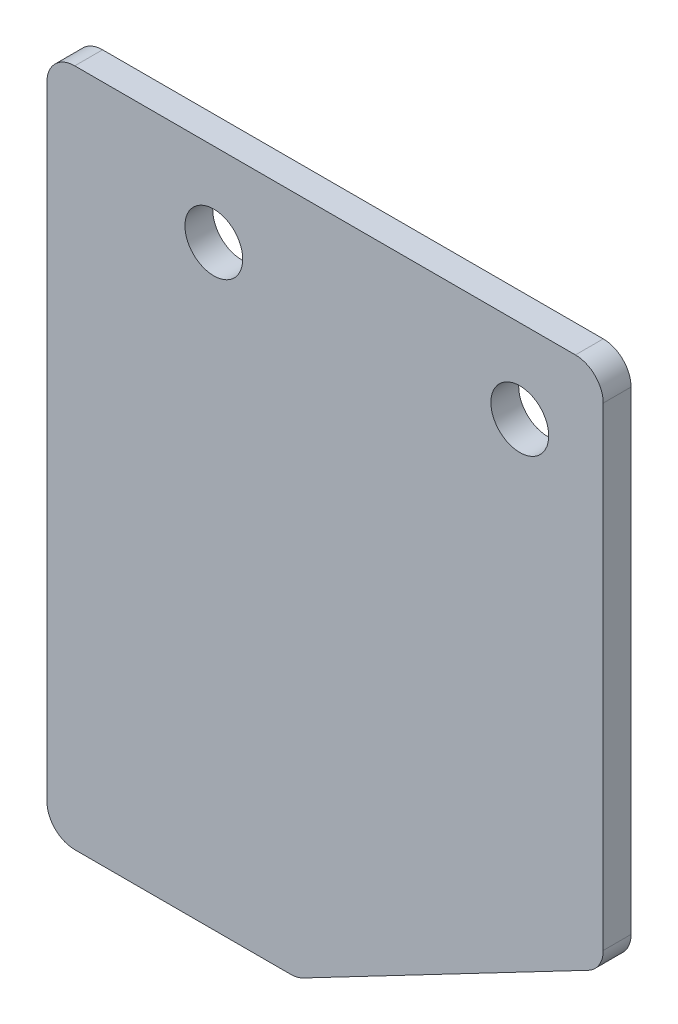
ISO-10303-21;
HEADER;
FILE_DESCRIPTION(('STEP AP214'),'2;1');
FILE_NAME('part.step','',(''),(''),'','','');
FILE_SCHEMA(('AUTOMOTIVE_DESIGN { 1 0 10303 214 1 1 1 1 }'));
ENDSEC;
DATA;
#1=APPLICATION_CONTEXT('core data for automotive mechanical design processes');
#2=APPLICATION_PROTOCOL_DEFINITION('international standard','automotive_design',2000,#1);
#3=PRODUCT_CONTEXT('',#1,'mechanical');
#4=PRODUCT('Part','Part','',(#3));
#5=PRODUCT_RELATED_PRODUCT_CATEGORY('part','',(#4));
#6=PRODUCT_DEFINITION_FORMATION('','',#4);
#7=PRODUCT_DEFINITION_CONTEXT('part definition',#1,'design');
#8=PRODUCT_DEFINITION('design','',#6,#7);
#9=PRODUCT_DEFINITION_SHAPE('','',#8);
#10=(LENGTH_UNIT() NAMED_UNIT(*) SI_UNIT(.MILLI.,.METRE.));
#11=(NAMED_UNIT(*) PLANE_ANGLE_UNIT() SI_UNIT($,.RADIAN.));
#12=(NAMED_UNIT(*) SI_UNIT($,.STERADIAN.) SOLID_ANGLE_UNIT());
#13=UNCERTAINTY_MEASURE_WITH_UNIT(LENGTH_MEASURE(1.E-05),#10,'distance_accuracy_value','');
#14=(GEOMETRIC_REPRESENTATION_CONTEXT(3) GLOBAL_UNCERTAINTY_ASSIGNED_CONTEXT((#13)) GLOBAL_UNIT_ASSIGNED_CONTEXT((#10,
#11,#12)) REPRESENTATION_CONTEXT('',''));
#15=CARTESIAN_POINT('',(0.,0.,0.));
#16=DIRECTION('',(0.,0.,1.));
#17=DIRECTION('',(1.,0.,0.));
#18=AXIS2_PLACEMENT_3D('',#15,#16,#17);
#19=CARTESIAN_POINT('',(63.5,-20.3365254026944,-1.69135538907739E-13));
#20=DIRECTION('',(-1.,0.,0.));
#21=DIRECTION('',(0.,-0.707106781186544,-0.707106781186551));
#22=AXIS2_PLACEMENT_3D('',#19,#20,#21);
#23=PLANE('',#22);
#24=DIRECTION('',(0.,1.,0.));
#25=VECTOR('',#24,1.);
#26=CARTESIAN_POINT('',(63.5,-20.3365254026944,3.17499999999984));
#27=LINE('',#26,#25);
#28=CARTESIAN_POINT('',(63.5,53.975,3.175));
#29=VERTEX_POINT('',#28);
#30=CARTESIAN_POINT('',(63.5,-0.135098473034324,3.17499999999997));
#31=VERTEX_POINT('',#30);
#32=EDGE_CURVE('E224',#29,#31,#27,.F.);
#33=ORIENTED_EDGE('',*,*,#32,.T.);
#34=DIRECTION('',(0.,0.,-1.));
#35=VECTOR('',#34,1.);
#36=CARTESIAN_POINT('',(63.5,-0.135098473034306,0.));
#37=LINE('',#36,#35);
#38=CARTESIAN_POINT('',(63.5,-0.135098473034306,0.));
#39=VERTEX_POINT('',#38);
#40=EDGE_CURVE('E14',#31,#39,#37,.T.);
#41=ORIENTED_EDGE('',*,*,#40,.T.);
#42=DIRECTION('',(0.,-1.,0.));
#43=VECTOR('',#42,1.);
#44=CARTESIAN_POINT('',(63.5,18.6934105670383,1.02782365951626E-13));
#45=LINE('',#44,#43);
#46=CARTESIAN_POINT('',(63.5,53.975,0.));
#47=VERTEX_POINT('',#46);
#48=EDGE_CURVE('E229',#47,#39,#45,.T.);
#49=ORIENTED_EDGE('',*,*,#48,.F.);
#50=DIRECTION('',(0.,0.,-1.));
#51=VECTOR('',#50,1.);
#52=CARTESIAN_POINT('',(63.5,53.975,3.175));
#53=LINE('',#52,#51);
#54=EDGE_CURVE('E171',#47,#29,#53,.F.);
#55=ORIENTED_EDGE('',*,*,#54,.T.);
#56=EDGE_LOOP('',(#33,#41,#49,#55));
#57=FACE_BOUND('',#56,.T.);
#58=ADVANCED_FACE('F63',(#57),#23,.F.);
#59=CARTESIAN_POINT('',(0.,16.4483465367711,1.13624387676481E-13));
#60=DIRECTION('',(1.,0.,0.));
#61=DIRECTION('',(0.,0.707106781186544,0.707106781186551));
#62=AXIS2_PLACEMENT_3D('',#59,#60,#61);
#63=PLANE('',#62);
#64=DIRECTION('',(0.,1.,0.));
#65=VECTOR('',#64,1.);
#66=CARTESIAN_POINT('',(0.,18.6934105670383,1.30971622436249E-13));
#67=LINE('',#66,#65);
#68=CARTESIAN_POINT('',(0.,-17.1615254026944,-1.20563281580388E-13));
#69=VERTEX_POINT('',#68);
#70=CARTESIAN_POINT('',(0.,53.975,0.));
#71=VERTEX_POINT('',#70);
#72=EDGE_CURVE('E140',#69,#71,#67,.T.);
#73=ORIENTED_EDGE('',*,*,#72,.F.);
#74=DIRECTION('',(0.,0.,1.));
#75=VECTOR('',#74,1.);
#76=CARTESIAN_POINT('',(0.,-17.1615254026944,-1.20563281580388E-13));
#77=LINE('',#76,#75);
#78=CARTESIAN_POINT('',(0.,-17.1615254026944,3.17499999999988));
#79=VERTEX_POINT('',#78);
#80=EDGE_CURVE('E154',#69,#79,#77,.T.);
#81=ORIENTED_EDGE('',*,*,#80,.T.);
#82=DIRECTION('',(0.,-1.,0.));
#83=VECTOR('',#82,1.);
#84=CARTESIAN_POINT('',(0.,16.448346536771,3.17500000000012));
#85=LINE('',#84,#83);
#86=CARTESIAN_POINT('',(0.,53.975,3.175));
#87=VERTEX_POINT('',#86);
#88=EDGE_CURVE('E161',#79,#87,#85,.F.);
#89=ORIENTED_EDGE('',*,*,#88,.T.);
#90=DIRECTION('',(0.,0.,-1.));
#91=VECTOR('',#90,1.);
#92=CARTESIAN_POINT('',(0.,53.975,3.175));
#93=LINE('',#92,#91);
#94=EDGE_CURVE('E158',#87,#71,#93,.T.);
#95=ORIENTED_EDGE('',*,*,#94,.T.);
#96=EDGE_LOOP('',(#73,#81,#89,#95));
#97=FACE_BOUND('',#96,.T.);
#98=ADVANCED_FACE('F159',(#97),#63,.F.);
#99=CARTESIAN_POINT('',(0.,18.6934105670383,1.30971622436249E-13));
#100=DIRECTION('',(0.,0.,1.));
#101=DIRECTION('',(0.,-1.,0.));
#102=AXIS2_PLACEMENT_3D('',#99,#100,#101);
#103=PLANE('',#102);
#104=DIRECTION('',(-1.,0.,0.));
#105=VECTOR('',#104,1.);
#106=CARTESIAN_POINT('',(0.,-20.3365254026944,-1.37910516340156E-13));
#107=LINE('',#106,#105);
#108=CARTESIAN_POINT('',(27.7943403610849,-20.3365254026944,-1.51788304147971E-13));
#109=VERTEX_POINT('',#108);
#110=CARTESIAN_POINT('',(3.17499999999999,-20.3365254026944,-1.37910516340156E-13));
#111=VERTEX_POINT('',#110);
#112=EDGE_CURVE('E155',#109,#111,#107,.T.);
#113=ORIENTED_EDGE('',*,*,#112,.T.);
#114=CARTESIAN_POINT('',(3.17499999999999,-17.1615254026944,-1.17093834628434E-13));
#115=DIRECTION('',(0.,0.,1.));
#116=DIRECTION('',(0.,-1.,0.));
#117=AXIS2_PLACEMENT_3D('',#114,#115,#116);
#118=CIRCLE('',#117,3.175);
#119=EDGE_CURVE('E150',#111,#69,#118,.F.);
#120=ORIENTED_EDGE('',*,*,#119,.T.);
#121=ORIENTED_EDGE('',*,*,#72,.T.);
#122=CARTESIAN_POINT('',(3.175,53.975,0.));
#123=DIRECTION('',(0.,0.,-1.));
#124=DIRECTION('',(-1.,0.,0.));
#125=AXIS2_PLACEMENT_3D('',#122,#123,#124);
#126=CIRCLE('',#125,3.175);
#127=CARTESIAN_POINT('',(3.175,57.15,0.));
#128=VERTEX_POINT('',#127);
#129=EDGE_CURVE('E147',#71,#128,#126,.T.);
#130=ORIENTED_EDGE('',*,*,#129,.T.);
#131=DIRECTION('',(-1.,0.,0.));
#132=VECTOR('',#131,1.);
#133=CARTESIAN_POINT('',(0.,57.15,0.));
#134=LINE('',#133,#132);
#135=CARTESIAN_POINT('',(60.325,57.15,0.));
#136=VERTEX_POINT('',#135);
#137=EDGE_CURVE('E255',#136,#128,#134,.T.);
#138=ORIENTED_EDGE('',*,*,#137,.F.);
#139=CARTESIAN_POINT('',(60.325,53.975,0.));
#140=DIRECTION('',(0.,0.,-1.));
#141=DIRECTION('',(-1.,0.,0.));
#142=AXIS2_PLACEMENT_3D('',#139,#140,#141);
#143=CIRCLE('',#142,3.175);
#144=EDGE_CURVE('E165',#136,#47,#143,.T.);
#145=ORIENTED_EDGE('',*,*,#144,.T.);
#146=ORIENTED_EDGE('',*,*,#48,.T.);
#147=CARTESIAN_POINT('',(60.325,-0.135098473034306,0.));
#148=DIRECTION('',(0.,0.,1.));
#149=DIRECTION('',(0.,-1.,0.));
#150=AXIS2_PLACEMENT_3D('',#147,#148,#149);
#151=CIRCLE('',#150,3.175);
#152=CARTESIAN_POINT('',(61.7973100042708,-2.94809123010356,0.));
#153=VERTEX_POINT('',#152);
#154=EDGE_CURVE('E78',#39,#153,#151,.F.);
#155=ORIENTED_EDGE('',*,*,#154,.T.);
#156=DIRECTION('',(0.885981970730476,0.463719686384503,0.));
#157=VECTOR('',#156,1.);
#158=CARTESIAN_POINT('',(63.5,-2.05690958429808,0.));
#159=LINE('',#158,#157);
#160=CARTESIAN_POINT('',(29.2666503653557,-19.9745181597637,-1.44849410244063E-13));
#161=VERTEX_POINT('',#160);
#162=EDGE_CURVE('E164',#161,#153,#159,.T.);
#163=ORIENTED_EDGE('',*,*,#162,.F.);
#164=CARTESIAN_POINT('',(27.7943403610849,-17.1615254026944,-1.37910516340156E-13));
#165=DIRECTION('',(0.,0.,1.));
#166=DIRECTION('',(0.,-1.,0.));
#167=AXIS2_PLACEMENT_3D('',#164,#165,#166);
#168=CIRCLE('',#167,3.175);
#169=EDGE_CURVE('E86',#161,#109,#168,.F.);
#170=ORIENTED_EDGE('',*,*,#169,.T.);
#171=EDGE_LOOP('',(#113,#120,#121,#130,#138,#145,#146,#155,#163,#170));
#172=FACE_BOUND('',#171,.T.);
#173=CARTESIAN_POINT('',(53.975,47.625,0.));
#174=DIRECTION('',(0.,0.,-1.));
#175=DIRECTION('',(-1.,0.,0.));
#176=AXIS2_PLACEMENT_3D('',#173,#174,#175);
#177=CIRCLE('',#176,3.29999999999999);
#178=CARTESIAN_POINT('',(50.675,47.625,0.));
#179=VERTEX_POINT('',#178);
#180=EDGE_CURVE('E265',#179,#179,#177,.T.);
#181=ORIENTED_EDGE('',*,*,#180,.F.);
#182=EDGE_LOOP('',(#181));
#183=FACE_BOUND('',#182,.T.);
#184=CARTESIAN_POINT('',(19.05,47.625,0.));
#185=DIRECTION('',(0.,0.,-1.));
#186=DIRECTION('',(-1.,0.,0.));
#187=AXIS2_PLACEMENT_3D('',#184,#185,#186);
#188=CIRCLE('',#187,3.29999999999999);
#189=CARTESIAN_POINT('',(15.75,47.625,0.));
#190=VERTEX_POINT('',#189);
#191=EDGE_CURVE('E258',#190,#190,#188,.T.);
#192=ORIENTED_EDGE('',*,*,#191,.F.);
#193=EDGE_LOOP('',(#192));
#194=FACE_BOUND('',#193,.T.);
#195=ADVANCED_FACE('F143',(#172,#183,#194),#103,.F.);
#196=CARTESIAN_POINT('',(0.,0.,3.175));
#197=DIRECTION('',(0.,0.,-1.));
#198=DIRECTION('',(-1.,0.,0.));
#199=AXIS2_PLACEMENT_3D('',#196,#197,#198);
#200=PLANE('',#199);
#201=ORIENTED_EDGE('',*,*,#88,.F.);
#202=CARTESIAN_POINT('',(3.17499999999999,-17.1615254026944,3.17499999999988));
#203=DIRECTION('',(0.,0.,1.));
#204=DIRECTION('',(0.,-1.,0.));
#205=AXIS2_PLACEMENT_3D('',#202,#203,#204);
#206=CIRCLE('',#205,3.175);
#207=CARTESIAN_POINT('',(3.17499999999999,-20.3365254026944,3.17499999999986));
#208=VERTEX_POINT('',#207);
#209=EDGE_CURVE('E203',#79,#208,#206,.T.);
#210=ORIENTED_EDGE('',*,*,#209,.T.);
#211=DIRECTION('',(1.,0.,0.));
#212=VECTOR('',#211,1.);
#213=CARTESIAN_POINT('',(0.,-20.3365254026944,3.17499999999986));
#214=LINE('',#213,#212);
#215=CARTESIAN_POINT('',(27.7943403610849,-20.3365254026944,3.17499999999985));
#216=VERTEX_POINT('',#215);
#217=EDGE_CURVE('E232',#216,#208,#214,.F.);
#218=ORIENTED_EDGE('',*,*,#217,.F.);
#219=CARTESIAN_POINT('',(27.7943403610849,-17.1615254026944,3.17499999999987));
#220=DIRECTION('',(0.,0.,1.));
#221=DIRECTION('',(0.,-1.,0.));
#222=AXIS2_PLACEMENT_3D('',#219,#220,#221);
#223=CIRCLE('',#222,3.175);
#224=CARTESIAN_POINT('',(29.2666503653557,-19.9745181597637,3.17499999999986));
#225=VERTEX_POINT('',#224);
#226=EDGE_CURVE('E199',#216,#225,#223,.T.);
#227=ORIENTED_EDGE('',*,*,#226,.T.);
#228=DIRECTION('',(0.885981970730476,0.463719686384503,0.));
#229=VECTOR('',#228,1.);
#230=CARTESIAN_POINT('',(63.5,-2.0569095842981,3.17499999999996));
#231=LINE('',#230,#229);
#232=CARTESIAN_POINT('',(61.7973100042708,-2.94809123010359,3.17499999999996));
#233=VERTEX_POINT('',#232);
#234=EDGE_CURVE('E220',#225,#233,#231,.T.);
#235=ORIENTED_EDGE('',*,*,#234,.T.);
#236=CARTESIAN_POINT('',(60.325,-0.135098473034327,3.17499999999997));
#237=DIRECTION('',(0.,0.,1.));
#238=DIRECTION('',(0.,-1.,0.));
#239=AXIS2_PLACEMENT_3D('',#236,#237,#238);
#240=CIRCLE('',#239,3.175);
#241=EDGE_CURVE('E195',#233,#31,#240,.T.);
#242=ORIENTED_EDGE('',*,*,#241,.T.);
#243=ORIENTED_EDGE('',*,*,#32,.F.);
#244=CARTESIAN_POINT('',(60.325,53.975,3.175));
#245=DIRECTION('',(0.,0.,-1.));
#246=DIRECTION('',(-1.,0.,0.));
#247=AXIS2_PLACEMENT_3D('',#244,#245,#246);
#248=CIRCLE('',#247,3.175);
#249=CARTESIAN_POINT('',(60.325,57.15,3.175));
#250=VERTEX_POINT('',#249);
#251=EDGE_CURVE('E176',#29,#250,#248,.F.);
#252=ORIENTED_EDGE('',*,*,#251,.T.);
#253=DIRECTION('',(-1.,0.,0.));
#254=VECTOR('',#253,1.);
#255=CARTESIAN_POINT('',(0.,57.15,3.175));
#256=LINE('',#255,#254);
#257=CARTESIAN_POINT('',(3.175,57.15,3.175));
#258=VERTEX_POINT('',#257);
#259=EDGE_CURVE('E182',#250,#258,#256,.T.);
#260=ORIENTED_EDGE('',*,*,#259,.T.);
#261=CARTESIAN_POINT('',(3.175,53.975,3.175));
#262=DIRECTION('',(0.,0.,-1.));
#263=DIRECTION('',(-1.,0.,0.));
#264=AXIS2_PLACEMENT_3D('',#261,#262,#263);
#265=CIRCLE('',#264,3.175);
#266=EDGE_CURVE('E180',#258,#87,#265,.F.);
#267=ORIENTED_EDGE('',*,*,#266,.T.);
#268=EDGE_LOOP('',(#201,#210,#218,#227,#235,#242,#243,#252,#260,#267));
#269=FACE_BOUND('',#268,.T.);
#270=CARTESIAN_POINT('',(53.975,47.625,3.175));
#271=DIRECTION('',(0.,0.,1.));
#272=DIRECTION('',(1.,0.,0.));
#273=AXIS2_PLACEMENT_3D('',#270,#271,#272);
#274=CIRCLE('',#273,3.29999999999999);
#275=CARTESIAN_POINT('',(57.275,47.625,3.175));
#276=VERTEX_POINT('',#275);
#277=EDGE_CURVE('E186',#276,#276,#274,.T.);
#278=ORIENTED_EDGE('',*,*,#277,.F.);
#279=EDGE_LOOP('',(#278));
#280=FACE_BOUND('',#279,.T.);
#281=CARTESIAN_POINT('',(19.05,47.625,3.175));
#282=DIRECTION('',(0.,0.,1.));
#283=DIRECTION('',(1.,0.,0.));
#284=AXIS2_PLACEMENT_3D('',#281,#282,#283);
#285=CIRCLE('',#284,3.29999999999999);
#286=CARTESIAN_POINT('',(22.35,47.625,3.175));
#287=VERTEX_POINT('',#286);
#288=EDGE_CURVE('E262',#287,#287,#285,.T.);
#289=ORIENTED_EDGE('',*,*,#288,.F.);
#290=EDGE_LOOP('',(#289));
#291=FACE_BOUND('',#290,.T.);
#292=ADVANCED_FACE('F65',(#269,#280,#291),#200,.F.);
#293=CARTESIAN_POINT('',(0.,-20.3365254026944,-1.4137996329211E-13));
#294=DIRECTION('',(0.,1.,0.));
#295=DIRECTION('',(0.,0.,1.));
#296=AXIS2_PLACEMENT_3D('',#293,#294,#295);
#297=PLANE('',#296);
#298=ORIENTED_EDGE('',*,*,#217,.T.);
#299=DIRECTION('',(0.,0.,1.));
#300=VECTOR('',#299,1.);
#301=CARTESIAN_POINT('',(3.17499999999999,-20.3365254026944,-1.4137996329211E-13));
#302=LINE('',#301,#300);
#303=EDGE_CURVE('E209',#208,#111,#302,.F.);
#304=ORIENTED_EDGE('',*,*,#303,.T.);
#305=ORIENTED_EDGE('',*,*,#112,.F.);
#306=DIRECTION('',(0.,0.,-1.));
#307=VECTOR('',#306,1.);
#308=CARTESIAN_POINT('',(27.7943403610849,-20.3365254026944,-1.4137996329211E-13));
#309=LINE('',#308,#307);
#310=EDGE_CURVE('E207',#109,#216,#309,.F.);
#311=ORIENTED_EDGE('',*,*,#310,.T.);
#312=EDGE_LOOP('',(#298,#304,#305,#311));
#313=FACE_BOUND('',#312,.T.);
#314=ADVANCED_FACE('F247',(#313),#297,.F.);
#315=CARTESIAN_POINT('',(63.5,-2.0569095842981,3.17499999999996));
#316=DIRECTION('',(-0.463719686384503,0.885981970730476,0.));
#317=DIRECTION('',(0.,0.,1.));
#318=AXIS2_PLACEMENT_3D('',#315,#316,#317);
#319=PLANE('',#318);
#320=ORIENTED_EDGE('',*,*,#234,.F.);
#321=DIRECTION('',(0.,0.,-1.));
#322=VECTOR('',#321,1.);
#323=CARTESIAN_POINT('',(29.2666503653557,-19.9745181597637,3.17499999999984));
#324=LINE('',#323,#322);
#325=EDGE_CURVE('E71',#225,#161,#324,.T.);
#326=ORIENTED_EDGE('',*,*,#325,.T.);
#327=ORIENTED_EDGE('',*,*,#162,.T.);
#328=DIRECTION('',(0.,0.,-1.));
#329=VECTOR('',#328,1.);
#330=CARTESIAN_POINT('',(61.7973100042708,-2.94809123010359,3.17499999999996));
#331=LINE('',#330,#329);
#332=EDGE_CURVE('E214',#153,#233,#331,.F.);
#333=ORIENTED_EDGE('',*,*,#332,.T.);
#334=EDGE_LOOP('',(#320,#326,#327,#333));
#335=FACE_BOUND('',#334,.T.);
#336=ADVANCED_FACE('F217',(#335),#319,.F.);
#337=CARTESIAN_POINT('',(3.17499999999999,-17.1615254026944,-1.20563281580388E-13));
#338=DIRECTION('',(0.,0.,1.));
#339=DIRECTION('',(0.,-1.,0.));
#340=AXIS2_PLACEMENT_3D('',#337,#338,#339);
#341=CYLINDRICAL_SURFACE('',#340,3.175);
#342=ORIENTED_EDGE('',*,*,#119,.F.);
#343=ORIENTED_EDGE('',*,*,#303,.F.);
#344=ORIENTED_EDGE('',*,*,#209,.F.);
#345=ORIENTED_EDGE('',*,*,#80,.F.);
#346=EDGE_LOOP('',(#342,#343,#344,#345));
#347=FACE_BOUND('',#346,.T.);
#348=ADVANCED_FACE('F250',(#347),#341,.T.);
#349=CARTESIAN_POINT('',(27.7943403610849,-17.1615254026944,3.17499999999986));
#350=DIRECTION('',(0.,0.,-1.));
#351=DIRECTION('',(0.,1.,0.));
#352=AXIS2_PLACEMENT_3D('',#349,#350,#351);
#353=CYLINDRICAL_SURFACE('',#352,3.175);
#354=ORIENTED_EDGE('',*,*,#226,.F.);
#355=ORIENTED_EDGE('',*,*,#310,.F.);
#356=ORIENTED_EDGE('',*,*,#169,.F.);
#357=ORIENTED_EDGE('',*,*,#325,.F.);
#358=EDGE_LOOP('',(#354,#355,#356,#357));
#359=FACE_BOUND('',#358,.T.);
#360=ADVANCED_FACE('F245',(#359),#353,.T.);
#361=CARTESIAN_POINT('',(60.325,-0.135098473034306,0.));
#362=DIRECTION('',(0.,0.,-1.));
#363=DIRECTION('',(0.,1.,0.));
#364=AXIS2_PLACEMENT_3D('',#361,#362,#363);
#365=CYLINDRICAL_SURFACE('',#364,3.175);
#366=ORIENTED_EDGE('',*,*,#241,.F.);
#367=ORIENTED_EDGE('',*,*,#332,.F.);
#368=ORIENTED_EDGE('',*,*,#154,.F.);
#369=ORIENTED_EDGE('',*,*,#40,.F.);
#370=EDGE_LOOP('',(#366,#367,#368,#369));
#371=FACE_BOUND('',#370,.T.);
#372=ADVANCED_FACE('F242',(#371),#365,.T.);
#373=CARTESIAN_POINT('',(60.325,53.975,3.175));
#374=DIRECTION('',(0.,0.,1.));
#375=DIRECTION('',(1.,0.,0.));
#376=AXIS2_PLACEMENT_3D('',#373,#374,#375);
#377=CYLINDRICAL_SURFACE('',#376,3.175);
#378=ORIENTED_EDGE('',*,*,#144,.F.);
#379=DIRECTION('',(0.,0.,-1.));
#380=VECTOR('',#379,1.);
#381=CARTESIAN_POINT('',(60.325,57.15,3.175));
#382=LINE('',#381,#380);
#383=EDGE_CURVE('E256',#250,#136,#382,.T.);
#384=ORIENTED_EDGE('',*,*,#383,.F.);
#385=ORIENTED_EDGE('',*,*,#251,.F.);
#386=ORIENTED_EDGE('',*,*,#54,.F.);
#387=EDGE_LOOP('',(#378,#384,#385,#386));
#388=FACE_BOUND('',#387,.T.);
#389=ADVANCED_FACE('F299',(#388),#377,.T.);
#390=CARTESIAN_POINT('',(3.175,53.975,3.175));
#391=DIRECTION('',(0.,0.,1.));
#392=DIRECTION('',(1.,0.,0.));
#393=AXIS2_PLACEMENT_3D('',#390,#391,#392);
#394=CYLINDRICAL_SURFACE('',#393,3.175);
#395=ORIENTED_EDGE('',*,*,#129,.F.);
#396=ORIENTED_EDGE('',*,*,#94,.F.);
#397=ORIENTED_EDGE('',*,*,#266,.F.);
#398=DIRECTION('',(0.,0.,-1.));
#399=VECTOR('',#398,1.);
#400=CARTESIAN_POINT('',(3.175,57.15,3.175));
#401=LINE('',#400,#399);
#402=EDGE_CURVE('E170',#128,#258,#401,.F.);
#403=ORIENTED_EDGE('',*,*,#402,.F.);
#404=EDGE_LOOP('',(#395,#396,#397,#403));
#405=FACE_BOUND('',#404,.T.);
#406=ADVANCED_FACE('F168',(#405),#394,.T.);
#407=CARTESIAN_POINT('',(0.,57.15,3.175));
#408=DIRECTION('',(0.,-1.,0.));
#409=DIRECTION('',(-1.,0.,0.));
#410=AXIS2_PLACEMENT_3D('',#407,#408,#409);
#411=PLANE('',#410);
#412=ORIENTED_EDGE('',*,*,#137,.T.);
#413=ORIENTED_EDGE('',*,*,#402,.T.);
#414=ORIENTED_EDGE('',*,*,#259,.F.);
#415=ORIENTED_EDGE('',*,*,#383,.T.);
#416=EDGE_LOOP('',(#412,#413,#414,#415));
#417=FACE_BOUND('',#416,.T.);
#418=ADVANCED_FACE('F253',(#417),#411,.F.);
#419=CARTESIAN_POINT('',(19.05,47.625,3.175));
#420=DIRECTION('',(0.,0.,1.));
#421=DIRECTION('',(1.,0.,0.));
#422=AXIS2_PLACEMENT_3D('',#419,#420,#421);
#423=CYLINDRICAL_SURFACE('',#422,3.29999999999999);
#424=ORIENTED_EDGE('',*,*,#191,.T.);
#425=EDGE_LOOP('',(#424));
#426=FACE_BOUND('',#425,.T.);
#427=ORIENTED_EDGE('',*,*,#288,.T.);
#428=EDGE_LOOP('',(#427));
#429=FACE_BOUND('',#428,.T.);
#430=ADVANCED_FACE('F277',(#426,#429),#423,.F.);
#431=CARTESIAN_POINT('',(53.975,47.625,3.175));
#432=DIRECTION('',(0.,0.,1.));
#433=DIRECTION('',(1.,0.,0.));
#434=AXIS2_PLACEMENT_3D('',#431,#432,#433);
#435=CYLINDRICAL_SURFACE('',#434,3.29999999999999);
#436=ORIENTED_EDGE('',*,*,#180,.T.);
#437=EDGE_LOOP('',(#436));
#438=FACE_BOUND('',#437,.T.);
#439=ORIENTED_EDGE('',*,*,#277,.T.);
#440=EDGE_LOOP('',(#439));
#441=FACE_BOUND('',#440,.T.);
#442=ADVANCED_FACE('F272',(#438,#441),#435,.F.);
#443=CLOSED_SHELL('',(#58,#98,#195,#292,#314,#336,#348,#360,#372,#389,#406,#418,#430,#442));
#444=MANIFOLD_SOLID_BREP('B2',#443);
#445=ADVANCED_BREP_SHAPE_REPRESENTATION('',(#18,#444),#14);
#446=SHAPE_DEFINITION_REPRESENTATION(#9,#445);
ENDSEC;
END-ISO-10303-21;
